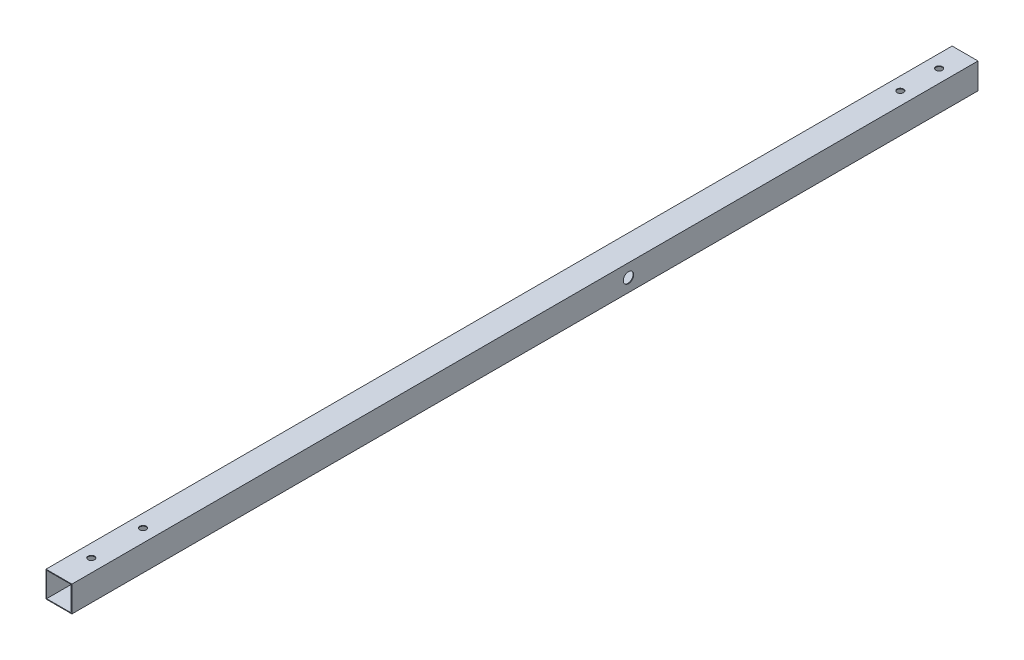
ISO-10303-21;
HEADER;
FILE_DESCRIPTION(('STEP AP214'),'2;1');
FILE_NAME('part.step','',(''),(''),'','','');
FILE_SCHEMA(('AUTOMOTIVE_DESIGN { 1 0 10303 214 1 1 1 1 }'));
ENDSEC;
DATA;
#1=APPLICATION_CONTEXT('core data for automotive mechanical design processes');
#2=APPLICATION_PROTOCOL_DEFINITION('international standard','automotive_design',2000,#1);
#3=PRODUCT_CONTEXT('',#1,'mechanical');
#4=PRODUCT('Part','Part','',(#3));
#5=PRODUCT_RELATED_PRODUCT_CATEGORY('part','',(#4));
#6=PRODUCT_DEFINITION_FORMATION('','',#4);
#7=PRODUCT_DEFINITION_CONTEXT('part definition',#1,'design');
#8=PRODUCT_DEFINITION('design','',#6,#7);
#9=PRODUCT_DEFINITION_SHAPE('','',#8);
#10=(LENGTH_UNIT() NAMED_UNIT(*) SI_UNIT(.MILLI.,.METRE.));
#11=(NAMED_UNIT(*) PLANE_ANGLE_UNIT() SI_UNIT($,.RADIAN.));
#12=(NAMED_UNIT(*) SI_UNIT($,.STERADIAN.) SOLID_ANGLE_UNIT());
#13=UNCERTAINTY_MEASURE_WITH_UNIT(LENGTH_MEASURE(1.E-05),#10,'distance_accuracy_value','');
#14=(GEOMETRIC_REPRESENTATION_CONTEXT(3) GLOBAL_UNCERTAINTY_ASSIGNED_CONTEXT((#13)) GLOBAL_UNIT_ASSIGNED_CONTEXT((#10,
#11,#12)) REPRESENTATION_CONTEXT('',''));
#15=CARTESIAN_POINT('',(0.,0.,0.));
#16=DIRECTION('',(0.,0.,1.));
#17=DIRECTION('',(1.,0.,0.));
#18=AXIS2_PLACEMENT_3D('',#15,#16,#17);
#19=CARTESIAN_POINT('',(10.,10.,700.));
#20=DIRECTION('',(-1.,0.,0.));
#21=DIRECTION('',(0.,-1.,0.));
#22=AXIS2_PLACEMENT_3D('',#19,#20,#21);
#23=PLANE('',#22);
#24=CARTESIAN_POINT('',(10.,0.,270.));
#25=DIRECTION('',(1.,0.,0.));
#26=DIRECTION('',(0.,1.,0.));
#27=AXIS2_PLACEMENT_3D('',#24,#25,#26);
#28=CIRCLE('',#27,3.99999999999999);
#29=CARTESIAN_POINT('',(10.,3.99999999999996,270.));
#30=VERTEX_POINT('',#29);
#31=EDGE_CURVE('E202',#30,#30,#28,.T.);
#32=ORIENTED_EDGE('',*,*,#31,.F.);
#33=EDGE_LOOP('',(#32));
#34=FACE_BOUND('',#33,.T.);
#35=DIRECTION('',(0.,1.,0.));
#36=VECTOR('',#35,1.);
#37=CARTESIAN_POINT('',(10.,10.,0.));
#38=LINE('',#37,#36);
#39=CARTESIAN_POINT('',(10.,-10.,0.));
#40=VERTEX_POINT('',#39);
#41=CARTESIAN_POINT('',(10.,10.,0.));
#42=VERTEX_POINT('',#41);
#43=EDGE_CURVE('E136',#40,#42,#38,.T.);
#44=ORIENTED_EDGE('',*,*,#43,.T.);
#45=DIRECTION('',(0.,0.,-1.));
#46=VECTOR('',#45,1.);
#47=CARTESIAN_POINT('',(10.,10.,700.));
#48=LINE('',#47,#46);
#49=CARTESIAN_POINT('',(10.,10.,700.));
#50=VERTEX_POINT('',#49);
#51=EDGE_CURVE('E11',#50,#42,#48,.T.);
#52=ORIENTED_EDGE('',*,*,#51,.F.);
#53=DIRECTION('',(0.,1.,0.));
#54=VECTOR('',#53,1.);
#55=CARTESIAN_POINT('',(10.,10.,700.));
#56=LINE('',#55,#54);
#57=CARTESIAN_POINT('',(10.,-10.,700.));
#58=VERTEX_POINT('',#57);
#59=EDGE_CURVE('E140',#58,#50,#56,.T.);
#60=ORIENTED_EDGE('',*,*,#59,.F.);
#61=DIRECTION('',(0.,0.,-1.));
#62=VECTOR('',#61,1.);
#63=CARTESIAN_POINT('',(10.,-10.,700.));
#64=LINE('',#63,#62);
#65=EDGE_CURVE('E150',#58,#40,#64,.T.);
#66=ORIENTED_EDGE('',*,*,#65,.T.);
#67=EDGE_LOOP('',(#44,#52,#60,#66));
#68=FACE_BOUND('',#67,.T.);
#69=ADVANCED_FACE('F34',(#34,#68),#23,.F.);
#70=CARTESIAN_POINT('',(-10.,10.,700.));
#71=DIRECTION('',(0.,-1.,0.));
#72=DIRECTION('',(0.,0.,-1.));
#73=AXIS2_PLACEMENT_3D('',#70,#71,#72);
#74=PLANE('',#73);
#75=CARTESIAN_POINT('',(0.,10.,20.));
#76=DIRECTION('',(0.,-1.,0.));
#77=DIRECTION('',(0.,0.,-1.));
#78=AXIS2_PLACEMENT_3D('',#75,#76,#77);
#79=CIRCLE('',#78,2.5);
#80=CARTESIAN_POINT('',(0.,10.,17.5));
#81=VERTEX_POINT('',#80);
#82=EDGE_CURVE('E180',#81,#81,#79,.T.);
#83=ORIENTED_EDGE('',*,*,#82,.T.);
#84=EDGE_LOOP('',(#83));
#85=FACE_BOUND('',#84,.T.);
#86=CARTESIAN_POINT('',(0.,10.,50.));
#87=DIRECTION('',(0.,-1.,0.));
#88=DIRECTION('',(0.,0.,-1.));
#89=AXIS2_PLACEMENT_3D('',#86,#87,#88);
#90=CIRCLE('',#89,2.5);
#91=CARTESIAN_POINT('',(0.,10.,47.5));
#92=VERTEX_POINT('',#91);
#93=EDGE_CURVE('E191',#92,#92,#90,.T.);
#94=ORIENTED_EDGE('',*,*,#93,.T.);
#95=EDGE_LOOP('',(#94));
#96=FACE_BOUND('',#95,.T.);
#97=CARTESIAN_POINT('',(0.,10.,635.));
#98=DIRECTION('',(0.,-1.,0.));
#99=DIRECTION('',(0.,0.,-1.));
#100=AXIS2_PLACEMENT_3D('',#97,#98,#99);
#101=CIRCLE('',#100,2.5);
#102=CARTESIAN_POINT('',(0.,10.,632.5));
#103=VERTEX_POINT('',#102);
#104=EDGE_CURVE('E169',#103,#103,#101,.T.);
#105=ORIENTED_EDGE('',*,*,#104,.T.);
#106=EDGE_LOOP('',(#105));
#107=FACE_BOUND('',#106,.T.);
#108=CARTESIAN_POINT('',(0.,10.,675.));
#109=DIRECTION('',(0.,-1.,0.));
#110=DIRECTION('',(0.,0.,-1.));
#111=AXIS2_PLACEMENT_3D('',#108,#109,#110);
#112=CIRCLE('',#111,2.5);
#113=CARTESIAN_POINT('',(0.,10.,672.5));
#114=VERTEX_POINT('',#113);
#115=EDGE_CURVE('E215',#114,#114,#112,.T.);
#116=ORIENTED_EDGE('',*,*,#115,.T.);
#117=EDGE_LOOP('',(#116));
#118=FACE_BOUND('',#117,.T.);
#119=DIRECTION('',(-1.,0.,0.));
#120=VECTOR('',#119,1.);
#121=CARTESIAN_POINT('',(-10.,10.,0.));
#122=LINE('',#121,#120);
#123=CARTESIAN_POINT('',(-10.,10.,0.));
#124=VERTEX_POINT('',#123);
#125=EDGE_CURVE('E153',#42,#124,#122,.T.);
#126=ORIENTED_EDGE('',*,*,#125,.T.);
#127=DIRECTION('',(0.,0.,-1.));
#128=VECTOR('',#127,1.);
#129=CARTESIAN_POINT('',(-10.,10.,700.));
#130=LINE('',#129,#128);
#131=CARTESIAN_POINT('',(-10.,10.,700.));
#132=VERTEX_POINT('',#131);
#133=EDGE_CURVE('E42',#132,#124,#130,.T.);
#134=ORIENTED_EDGE('',*,*,#133,.F.);
#135=DIRECTION('',(-1.,0.,0.));
#136=VECTOR('',#135,1.);
#137=CARTESIAN_POINT('',(-10.,10.,700.));
#138=LINE('',#137,#136);
#139=EDGE_CURVE('E143',#50,#132,#138,.T.);
#140=ORIENTED_EDGE('',*,*,#139,.F.);
#141=ORIENTED_EDGE('',*,*,#51,.T.);
#142=EDGE_LOOP('',(#126,#134,#140,#141));
#143=FACE_BOUND('',#142,.T.);
#144=ADVANCED_FACE('F244',(#85,#96,#107,#118,#143),#74,.F.);
#145=CARTESIAN_POINT('',(-10.,10.,700.));
#146=DIRECTION('',(1.,0.,0.));
#147=DIRECTION('',(0.,0.,-1.));
#148=AXIS2_PLACEMENT_3D('',#145,#146,#147);
#149=PLANE('',#148);
#150=CARTESIAN_POINT('',(-10.,0.,270.));
#151=DIRECTION('',(1.,0.,0.));
#152=DIRECTION('',(0.,1.,0.));
#153=AXIS2_PLACEMENT_3D('',#150,#151,#152);
#154=CIRCLE('',#153,3.99999999999999);
#155=CARTESIAN_POINT('',(-10.,3.99999999999996,270.));
#156=VERTEX_POINT('',#155);
#157=EDGE_CURVE('E176',#156,#156,#154,.T.);
#158=ORIENTED_EDGE('',*,*,#157,.T.);
#159=EDGE_LOOP('',(#158));
#160=FACE_BOUND('',#159,.T.);
#161=DIRECTION('',(0.,-1.,0.));
#162=VECTOR('',#161,1.);
#163=CARTESIAN_POINT('',(-10.,10.,0.));
#164=LINE('',#163,#162);
#165=CARTESIAN_POINT('',(-10.,-10.,0.));
#166=VERTEX_POINT('',#165);
#167=EDGE_CURVE('E155',#124,#166,#164,.T.);
#168=ORIENTED_EDGE('',*,*,#167,.T.);
#169=DIRECTION('',(0.,0.,-1.));
#170=VECTOR('',#169,1.);
#171=CARTESIAN_POINT('',(-10.,-10.,700.));
#172=LINE('',#171,#170);
#173=CARTESIAN_POINT('',(-10.,-10.,700.));
#174=VERTEX_POINT('',#173);
#175=EDGE_CURVE('E160',#174,#166,#172,.T.);
#176=ORIENTED_EDGE('',*,*,#175,.F.);
#177=DIRECTION('',(0.,-1.,0.));
#178=VECTOR('',#177,1.);
#179=CARTESIAN_POINT('',(-10.,10.,700.));
#180=LINE('',#179,#178);
#181=EDGE_CURVE('E146',#132,#174,#180,.T.);
#182=ORIENTED_EDGE('',*,*,#181,.F.);
#183=ORIENTED_EDGE('',*,*,#133,.T.);
#184=EDGE_LOOP('',(#168,#176,#182,#183));
#185=FACE_BOUND('',#184,.T.);
#186=ADVANCED_FACE('F251',(#160,#185),#149,.F.);
#187=CARTESIAN_POINT('',(-10.,-10.,700.));
#188=DIRECTION('',(0.,1.,0.));
#189=DIRECTION('',(0.,0.,1.));
#190=AXIS2_PLACEMENT_3D('',#187,#188,#189);
#191=PLANE('',#190);
#192=CARTESIAN_POINT('',(0.,-10.,20.));
#193=DIRECTION('',(0.,-1.,0.));
#194=DIRECTION('',(0.,0.,-1.));
#195=AXIS2_PLACEMENT_3D('',#192,#193,#194);
#196=CIRCLE('',#195,2.5);
#197=CARTESIAN_POINT('',(0.,-10.,17.5));
#198=VERTEX_POINT('',#197);
#199=EDGE_CURVE('E186',#198,#198,#196,.T.);
#200=ORIENTED_EDGE('',*,*,#199,.F.);
#201=EDGE_LOOP('',(#200));
#202=FACE_BOUND('',#201,.T.);
#203=CARTESIAN_POINT('',(0.,-10.,50.));
#204=DIRECTION('',(0.,-1.,0.));
#205=DIRECTION('',(0.,0.,-1.));
#206=AXIS2_PLACEMENT_3D('',#203,#204,#205);
#207=CIRCLE('',#206,2.5);
#208=CARTESIAN_POINT('',(0.,-10.,47.5));
#209=VERTEX_POINT('',#208);
#210=EDGE_CURVE('E196',#209,#209,#207,.T.);
#211=ORIENTED_EDGE('',*,*,#210,.F.);
#212=EDGE_LOOP('',(#211));
#213=FACE_BOUND('',#212,.T.);
#214=CARTESIAN_POINT('',(0.,-10.,635.));
#215=DIRECTION('',(0.,-1.,0.));
#216=DIRECTION('',(0.,0.,-1.));
#217=AXIS2_PLACEMENT_3D('',#214,#215,#216);
#218=CIRCLE('',#217,2.5);
#219=CARTESIAN_POINT('',(0.,-10.,632.5));
#220=VERTEX_POINT('',#219);
#221=EDGE_CURVE('E212',#220,#220,#218,.T.);
#222=ORIENTED_EDGE('',*,*,#221,.F.);
#223=EDGE_LOOP('',(#222));
#224=FACE_BOUND('',#223,.T.);
#225=CARTESIAN_POINT('',(0.,-10.,675.));
#226=DIRECTION('',(0.,-1.,0.));
#227=DIRECTION('',(0.,0.,-1.));
#228=AXIS2_PLACEMENT_3D('',#225,#226,#227);
#229=CIRCLE('',#228,2.5);
#230=CARTESIAN_POINT('',(0.,-10.,672.5));
#231=VERTEX_POINT('',#230);
#232=EDGE_CURVE('E209',#231,#231,#229,.T.);
#233=ORIENTED_EDGE('',*,*,#232,.F.);
#234=EDGE_LOOP('',(#233));
#235=FACE_BOUND('',#234,.T.);
#236=DIRECTION('',(1.,0.,0.));
#237=VECTOR('',#236,1.);
#238=CARTESIAN_POINT('',(-10.,-10.,0.));
#239=LINE('',#238,#237);
#240=EDGE_CURVE('E144',#166,#40,#239,.T.);
#241=ORIENTED_EDGE('',*,*,#240,.T.);
#242=ORIENTED_EDGE('',*,*,#65,.F.);
#243=DIRECTION('',(1.,0.,0.));
#244=VECTOR('',#243,1.);
#245=CARTESIAN_POINT('',(-10.,-10.,700.));
#246=LINE('',#245,#244);
#247=EDGE_CURVE('E148',#174,#58,#246,.T.);
#248=ORIENTED_EDGE('',*,*,#247,.F.);
#249=ORIENTED_EDGE('',*,*,#175,.T.);
#250=EDGE_LOOP('',(#241,#242,#248,#249));
#251=FACE_BOUND('',#250,.T.);
#252=ADVANCED_FACE('F268',(#202,#213,#224,#235,#251),#191,.F.);
#253=CARTESIAN_POINT('',(0.,0.,700.));
#254=DIRECTION('',(0.,0.,1.));
#255=DIRECTION('',(1.,0.,0.));
#256=AXIS2_PLACEMENT_3D('',#253,#254,#255);
#257=PLANE('',#256);
#258=DIRECTION('',(0.,1.,0.));
#259=VECTOR('',#258,1.);
#260=CARTESIAN_POINT('',(-9.5,9.5,700.));
#261=LINE('',#260,#259);
#262=CARTESIAN_POINT('',(-9.5,-9.5,700.));
#263=VERTEX_POINT('',#262);
#264=CARTESIAN_POINT('',(-9.5,9.5,700.));
#265=VERTEX_POINT('',#264);
#266=EDGE_CURVE('E102',#263,#265,#261,.T.);
#267=ORIENTED_EDGE('',*,*,#266,.T.);
#268=DIRECTION('',(1.,0.,0.));
#269=VECTOR('',#268,1.);
#270=CARTESIAN_POINT('',(9.5,9.5,700.));
#271=LINE('',#270,#269);
#272=CARTESIAN_POINT('',(9.5,9.5,700.));
#273=VERTEX_POINT('',#272);
#274=EDGE_CURVE('E111',#265,#273,#271,.T.);
#275=ORIENTED_EDGE('',*,*,#274,.T.);
#276=DIRECTION('',(0.,-1.,0.));
#277=VECTOR('',#276,1.);
#278=CARTESIAN_POINT('',(9.5,9.5,700.));
#279=LINE('',#278,#277);
#280=CARTESIAN_POINT('',(9.5,-9.5,700.));
#281=VERTEX_POINT('',#280);
#282=EDGE_CURVE('E50',#273,#281,#279,.T.);
#283=ORIENTED_EDGE('',*,*,#282,.T.);
#284=DIRECTION('',(-1.,0.,0.));
#285=VECTOR('',#284,1.);
#286=CARTESIAN_POINT('',(9.5,-9.5,700.));
#287=LINE('',#286,#285);
#288=EDGE_CURVE('E108',#281,#263,#287,.T.);
#289=ORIENTED_EDGE('',*,*,#288,.T.);
#290=EDGE_LOOP('',(#267,#275,#283,#289));
#291=FACE_BOUND('',#290,.T.);
#292=ORIENTED_EDGE('',*,*,#59,.T.);
#293=ORIENTED_EDGE('',*,*,#139,.T.);
#294=ORIENTED_EDGE('',*,*,#181,.T.);
#295=ORIENTED_EDGE('',*,*,#247,.T.);
#296=EDGE_LOOP('',(#292,#293,#294,#295));
#297=FACE_BOUND('',#296,.T.);
#298=ADVANCED_FACE('F115',(#291,#297),#257,.T.);
#299=CARTESIAN_POINT('',(0.,0.,0.));
#300=DIRECTION('',(0.,0.,1.));
#301=DIRECTION('',(1.,0.,0.));
#302=AXIS2_PLACEMENT_3D('',#299,#300,#301);
#303=PLANE('',#302);
#304=DIRECTION('',(1.,0.,0.));
#305=VECTOR('',#304,1.);
#306=CARTESIAN_POINT('',(9.5,9.5,0.));
#307=LINE('',#306,#305);
#308=CARTESIAN_POINT('',(-9.5,9.5,0.));
#309=VERTEX_POINT('',#308);
#310=CARTESIAN_POINT('',(9.5,9.5,0.));
#311=VERTEX_POINT('',#310);
#312=EDGE_CURVE('E130',#309,#311,#307,.T.);
#313=ORIENTED_EDGE('',*,*,#312,.F.);
#314=DIRECTION('',(0.,1.,0.));
#315=VECTOR('',#314,1.);
#316=CARTESIAN_POINT('',(-9.5,9.5,0.));
#317=LINE('',#316,#315);
#318=CARTESIAN_POINT('',(-9.5,-9.5,0.));
#319=VERTEX_POINT('',#318);
#320=EDGE_CURVE('E58',#319,#309,#317,.T.);
#321=ORIENTED_EDGE('',*,*,#320,.F.);
#322=DIRECTION('',(-1.,0.,0.));
#323=VECTOR('',#322,1.);
#324=CARTESIAN_POINT('',(9.5,-9.5,0.));
#325=LINE('',#324,#323);
#326=CARTESIAN_POINT('',(9.5,-9.5,0.));
#327=VERTEX_POINT('',#326);
#328=EDGE_CURVE('E118',#327,#319,#325,.T.);
#329=ORIENTED_EDGE('',*,*,#328,.F.);
#330=DIRECTION('',(0.,-1.,0.));
#331=VECTOR('',#330,1.);
#332=CARTESIAN_POINT('',(9.5,9.5,0.));
#333=LINE('',#332,#331);
#334=EDGE_CURVE('E121',#311,#327,#333,.T.);
#335=ORIENTED_EDGE('',*,*,#334,.F.);
#336=EDGE_LOOP('',(#313,#321,#329,#335));
#337=FACE_BOUND('',#336,.T.);
#338=ORIENTED_EDGE('',*,*,#43,.F.);
#339=ORIENTED_EDGE('',*,*,#240,.F.);
#340=ORIENTED_EDGE('',*,*,#167,.F.);
#341=ORIENTED_EDGE('',*,*,#125,.F.);
#342=EDGE_LOOP('',(#338,#339,#340,#341));
#343=FACE_BOUND('',#342,.T.);
#344=ADVANCED_FACE('F260',(#337,#343),#303,.F.);
#345=CARTESIAN_POINT('',(-9.5,9.5,700.));
#346=DIRECTION('',(-1.,0.,0.));
#347=DIRECTION('',(0.,-1.,0.));
#348=AXIS2_PLACEMENT_3D('',#345,#346,#347);
#349=PLANE('',#348);
#350=CARTESIAN_POINT('',(-9.5,0.,270.));
#351=DIRECTION('',(-1.,0.,0.));
#352=DIRECTION('',(0.,-1.,0.));
#353=AXIS2_PLACEMENT_3D('',#350,#351,#352);
#354=CIRCLE('',#353,3.99999999999999);
#355=CARTESIAN_POINT('',(-9.5,-4.00000000000003,270.));
#356=VERTEX_POINT('',#355);
#357=EDGE_CURVE('E175',#356,#356,#354,.T.);
#358=ORIENTED_EDGE('',*,*,#357,.T.);
#359=EDGE_LOOP('',(#358));
#360=FACE_BOUND('',#359,.T.);
#361=ORIENTED_EDGE('',*,*,#320,.T.);
#362=DIRECTION('',(0.,0.,-1.));
#363=VECTOR('',#362,1.);
#364=CARTESIAN_POINT('',(-9.5,9.5,700.));
#365=LINE('',#364,#363);
#366=EDGE_CURVE('E98',#265,#309,#365,.T.);
#367=ORIENTED_EDGE('',*,*,#366,.F.);
#368=ORIENTED_EDGE('',*,*,#266,.F.);
#369=DIRECTION('',(0.,0.,-1.));
#370=VECTOR('',#369,1.);
#371=CARTESIAN_POINT('',(-9.5,-9.5,700.));
#372=LINE('',#371,#370);
#373=EDGE_CURVE('E134',#263,#319,#372,.T.);
#374=ORIENTED_EDGE('',*,*,#373,.T.);
#375=EDGE_LOOP('',(#361,#367,#368,#374));
#376=FACE_BOUND('',#375,.T.);
#377=ADVANCED_FACE('F100',(#360,#376),#349,.F.);
#378=CARTESIAN_POINT('',(9.5,-9.5,700.));
#379=DIRECTION('',(0.,-1.,0.));
#380=DIRECTION('',(0.,0.,-1.));
#381=AXIS2_PLACEMENT_3D('',#378,#379,#380);
#382=PLANE('',#381);
#383=CARTESIAN_POINT('',(0.,-9.5,20.));
#384=DIRECTION('',(0.,-1.,0.));
#385=DIRECTION('',(0.,0.,-1.));
#386=AXIS2_PLACEMENT_3D('',#383,#384,#385);
#387=CIRCLE('',#386,2.5);
#388=CARTESIAN_POINT('',(0.,-9.5,17.5));
#389=VERTEX_POINT('',#388);
#390=EDGE_CURVE('E199',#389,#389,#387,.T.);
#391=ORIENTED_EDGE('',*,*,#390,.T.);
#392=EDGE_LOOP('',(#391));
#393=FACE_BOUND('',#392,.T.);
#394=CARTESIAN_POINT('',(0.,-9.5,50.));
#395=DIRECTION('',(0.,-1.,0.));
#396=DIRECTION('',(0.,0.,-1.));
#397=AXIS2_PLACEMENT_3D('',#394,#395,#396);
#398=CIRCLE('',#397,2.5);
#399=CARTESIAN_POINT('',(0.,-9.5,47.5));
#400=VERTEX_POINT('',#399);
#401=EDGE_CURVE('E179',#400,#400,#398,.T.);
#402=ORIENTED_EDGE('',*,*,#401,.T.);
#403=EDGE_LOOP('',(#402));
#404=FACE_BOUND('',#403,.T.);
#405=CARTESIAN_POINT('',(0.,-9.5,635.));
#406=DIRECTION('',(0.,-1.,0.));
#407=DIRECTION('',(0.,0.,-1.));
#408=AXIS2_PLACEMENT_3D('',#405,#406,#407);
#409=CIRCLE('',#408,2.5);
#410=CARTESIAN_POINT('',(0.,-9.5,632.5));
#411=VERTEX_POINT('',#410);
#412=EDGE_CURVE('E124',#411,#411,#409,.T.);
#413=ORIENTED_EDGE('',*,*,#412,.T.);
#414=EDGE_LOOP('',(#413));
#415=FACE_BOUND('',#414,.T.);
#416=CARTESIAN_POINT('',(0.,-9.5,675.));
#417=DIRECTION('',(0.,-1.,0.));
#418=DIRECTION('',(0.,0.,-1.));
#419=AXIS2_PLACEMENT_3D('',#416,#417,#418);
#420=CIRCLE('',#419,2.5);
#421=CARTESIAN_POINT('',(0.,-9.5,672.5));
#422=VERTEX_POINT('',#421);
#423=EDGE_CURVE('E168',#422,#422,#420,.T.);
#424=ORIENTED_EDGE('',*,*,#423,.T.);
#425=EDGE_LOOP('',(#424));
#426=FACE_BOUND('',#425,.T.);
#427=ORIENTED_EDGE('',*,*,#328,.T.);
#428=ORIENTED_EDGE('',*,*,#373,.F.);
#429=ORIENTED_EDGE('',*,*,#288,.F.);
#430=DIRECTION('',(0.,0.,-1.));
#431=VECTOR('',#430,1.);
#432=CARTESIAN_POINT('',(9.5,-9.5,700.));
#433=LINE('',#432,#431);
#434=EDGE_CURVE('E137',#281,#327,#433,.T.);
#435=ORIENTED_EDGE('',*,*,#434,.T.);
#436=EDGE_LOOP('',(#427,#428,#429,#435));
#437=FACE_BOUND('',#436,.T.);
#438=ADVANCED_FACE('F222',(#393,#404,#415,#426,#437),#382,.F.);
#439=CARTESIAN_POINT('',(9.5,9.5,700.));
#440=DIRECTION('',(1.,0.,0.));
#441=DIRECTION('',(0.,1.,0.));
#442=AXIS2_PLACEMENT_3D('',#439,#440,#441);
#443=PLANE('',#442);
#444=CARTESIAN_POINT('',(9.5,0.,270.));
#445=DIRECTION('',(1.,0.,0.));
#446=DIRECTION('',(0.,1.,0.));
#447=AXIS2_PLACEMENT_3D('',#444,#445,#446);
#448=CIRCLE('',#447,3.99999999999999);
#449=CARTESIAN_POINT('',(9.5,3.99999999999996,270.));
#450=VERTEX_POINT('',#449);
#451=EDGE_CURVE('E173',#450,#450,#448,.T.);
#452=ORIENTED_EDGE('',*,*,#451,.T.);
#453=EDGE_LOOP('',(#452));
#454=FACE_BOUND('',#453,.T.);
#455=ORIENTED_EDGE('',*,*,#334,.T.);
#456=ORIENTED_EDGE('',*,*,#434,.F.);
#457=ORIENTED_EDGE('',*,*,#282,.F.);
#458=DIRECTION('',(0.,0.,-1.));
#459=VECTOR('',#458,1.);
#460=CARTESIAN_POINT('',(9.5,9.5,700.));
#461=LINE('',#460,#459);
#462=EDGE_CURVE('E107',#273,#311,#461,.T.);
#463=ORIENTED_EDGE('',*,*,#462,.T.);
#464=EDGE_LOOP('',(#455,#456,#457,#463));
#465=FACE_BOUND('',#464,.T.);
#466=ADVANCED_FACE('F288',(#454,#465),#443,.F.);
#467=CARTESIAN_POINT('',(9.5,9.5,700.));
#468=DIRECTION('',(0.,1.,0.));
#469=DIRECTION('',(0.,0.,1.));
#470=AXIS2_PLACEMENT_3D('',#467,#468,#469);
#471=PLANE('',#470);
#472=CARTESIAN_POINT('',(0.,9.5,20.));
#473=DIRECTION('',(0.,1.,0.));
#474=DIRECTION('',(0.,0.,1.));
#475=AXIS2_PLACEMENT_3D('',#472,#473,#474);
#476=CIRCLE('',#475,2.5);
#477=CARTESIAN_POINT('',(0.,9.5,22.5));
#478=VERTEX_POINT('',#477);
#479=EDGE_CURVE('E37',#478,#478,#476,.T.);
#480=ORIENTED_EDGE('',*,*,#479,.T.);
#481=EDGE_LOOP('',(#480));
#482=FACE_BOUND('',#481,.T.);
#483=CARTESIAN_POINT('',(0.,9.5,50.));
#484=DIRECTION('',(0.,1.,0.));
#485=DIRECTION('',(0.,0.,1.));
#486=AXIS2_PLACEMENT_3D('',#483,#484,#485);
#487=CIRCLE('',#486,2.5);
#488=CARTESIAN_POINT('',(0.,9.5,52.5));
#489=VERTEX_POINT('',#488);
#490=EDGE_CURVE('E177',#489,#489,#487,.T.);
#491=ORIENTED_EDGE('',*,*,#490,.T.);
#492=EDGE_LOOP('',(#491));
#493=FACE_BOUND('',#492,.T.);
#494=CARTESIAN_POINT('',(0.,9.5,635.));
#495=DIRECTION('',(0.,1.,0.));
#496=DIRECTION('',(0.,0.,1.));
#497=AXIS2_PLACEMENT_3D('',#494,#495,#496);
#498=CIRCLE('',#497,2.5);
#499=CARTESIAN_POINT('',(0.,9.5,637.5));
#500=VERTEX_POINT('',#499);
#501=EDGE_CURVE('E170',#500,#500,#498,.T.);
#502=ORIENTED_EDGE('',*,*,#501,.T.);
#503=EDGE_LOOP('',(#502));
#504=FACE_BOUND('',#503,.T.);
#505=CARTESIAN_POINT('',(0.,9.5,675.));
#506=DIRECTION('',(0.,1.,0.));
#507=DIRECTION('',(0.,0.,1.));
#508=AXIS2_PLACEMENT_3D('',#505,#506,#507);
#509=CIRCLE('',#508,2.5);
#510=CARTESIAN_POINT('',(0.,9.5,677.5));
#511=VERTEX_POINT('',#510);
#512=EDGE_CURVE('E165',#511,#511,#509,.T.);
#513=ORIENTED_EDGE('',*,*,#512,.T.);
#514=EDGE_LOOP('',(#513));
#515=FACE_BOUND('',#514,.T.);
#516=ORIENTED_EDGE('',*,*,#312,.T.);
#517=ORIENTED_EDGE('',*,*,#462,.F.);
#518=ORIENTED_EDGE('',*,*,#274,.F.);
#519=ORIENTED_EDGE('',*,*,#366,.T.);
#520=EDGE_LOOP('',(#516,#517,#518,#519));
#521=FACE_BOUND('',#520,.T.);
#522=ADVANCED_FACE('F112',(#482,#493,#504,#515,#521),#471,.F.);
#523=CARTESIAN_POINT('',(0.,10.,675.));
#524=DIRECTION('',(0.,-1.,0.));
#525=DIRECTION('',(0.,0.,-1.));
#526=AXIS2_PLACEMENT_3D('',#523,#524,#525);
#527=CYLINDRICAL_SURFACE('',#526,2.5);
#528=ORIENTED_EDGE('',*,*,#115,.F.);
#529=EDGE_LOOP('',(#528));
#530=FACE_BOUND('',#529,.T.);
#531=ORIENTED_EDGE('',*,*,#512,.F.);
#532=EDGE_LOOP('',(#531));
#533=FACE_BOUND('',#532,.T.);
#534=ADVANCED_FACE('F231',(#530,#533),#527,.F.);
#535=CARTESIAN_POINT('',(0.,10.,635.));
#536=DIRECTION('',(0.,-1.,0.));
#537=DIRECTION('',(0.,0.,-1.));
#538=AXIS2_PLACEMENT_3D('',#535,#536,#537);
#539=CYLINDRICAL_SURFACE('',#538,2.5);
#540=ORIENTED_EDGE('',*,*,#104,.F.);
#541=EDGE_LOOP('',(#540));
#542=FACE_BOUND('',#541,.T.);
#543=ORIENTED_EDGE('',*,*,#501,.F.);
#544=EDGE_LOOP('',(#543));
#545=FACE_BOUND('',#544,.T.);
#546=ADVANCED_FACE('F228',(#542,#545),#539,.F.);
#547=ORIENTED_EDGE('',*,*,#232,.T.);
#548=EDGE_LOOP('',(#547));
#549=FACE_BOUND('',#548,.T.);
#550=ORIENTED_EDGE('',*,*,#423,.F.);
#551=EDGE_LOOP('',(#550));
#552=FACE_BOUND('',#551,.T.);
#553=ADVANCED_FACE('F225',(#549,#552),#527,.F.);
#554=ORIENTED_EDGE('',*,*,#221,.T.);
#555=EDGE_LOOP('',(#554));
#556=FACE_BOUND('',#555,.T.);
#557=ORIENTED_EDGE('',*,*,#412,.F.);
#558=EDGE_LOOP('',(#557));
#559=FACE_BOUND('',#558,.T.);
#560=ADVANCED_FACE('F227',(#556,#559),#539,.F.);
#561=CARTESIAN_POINT('',(-10.,0.,270.));
#562=DIRECTION('',(1.,0.,0.));
#563=DIRECTION('',(0.,1.,0.));
#564=AXIS2_PLACEMENT_3D('',#561,#562,#563);
#565=CYLINDRICAL_SURFACE('',#564,3.99999999999999);
#566=ORIENTED_EDGE('',*,*,#31,.T.);
#567=EDGE_LOOP('',(#566));
#568=FACE_BOUND('',#567,.T.);
#569=ORIENTED_EDGE('',*,*,#451,.F.);
#570=EDGE_LOOP('',(#569));
#571=FACE_BOUND('',#570,.T.);
#572=ADVANCED_FACE('F236',(#568,#571),#565,.F.);
#573=ORIENTED_EDGE('',*,*,#157,.F.);
#574=EDGE_LOOP('',(#573));
#575=FACE_BOUND('',#574,.T.);
#576=ORIENTED_EDGE('',*,*,#357,.F.);
#577=EDGE_LOOP('',(#576));
#578=FACE_BOUND('',#577,.T.);
#579=ADVANCED_FACE('F320',(#575,#578),#565,.F.);
#580=CARTESIAN_POINT('',(0.,10.,50.));
#581=DIRECTION('',(0.,-1.,0.));
#582=DIRECTION('',(0.,0.,-1.));
#583=AXIS2_PLACEMENT_3D('',#580,#581,#582);
#584=CYLINDRICAL_SURFACE('',#583,2.5);
#585=ORIENTED_EDGE('',*,*,#93,.F.);
#586=EDGE_LOOP('',(#585));
#587=FACE_BOUND('',#586,.T.);
#588=ORIENTED_EDGE('',*,*,#490,.F.);
#589=EDGE_LOOP('',(#588));
#590=FACE_BOUND('',#589,.T.);
#591=ADVANCED_FACE('F310',(#587,#590),#584,.F.);
#592=CARTESIAN_POINT('',(0.,10.,20.));
#593=DIRECTION('',(0.,-1.,0.));
#594=DIRECTION('',(0.,0.,-1.));
#595=AXIS2_PLACEMENT_3D('',#592,#593,#594);
#596=CYLINDRICAL_SURFACE('',#595,2.5);
#597=ORIENTED_EDGE('',*,*,#82,.F.);
#598=EDGE_LOOP('',(#597));
#599=FACE_BOUND('',#598,.T.);
#600=ORIENTED_EDGE('',*,*,#479,.F.);
#601=EDGE_LOOP('',(#600));
#602=FACE_BOUND('',#601,.T.);
#603=ADVANCED_FACE('F307',(#599,#602),#596,.F.);
#604=ORIENTED_EDGE('',*,*,#210,.T.);
#605=EDGE_LOOP('',(#604));
#606=FACE_BOUND('',#605,.T.);
#607=ORIENTED_EDGE('',*,*,#401,.F.);
#608=EDGE_LOOP('',(#607));
#609=FACE_BOUND('',#608,.T.);
#610=ADVANCED_FACE('F304',(#606,#609),#584,.F.);
#611=ORIENTED_EDGE('',*,*,#199,.T.);
#612=EDGE_LOOP('',(#611));
#613=FACE_BOUND('',#612,.T.);
#614=ORIENTED_EDGE('',*,*,#390,.F.);
#615=EDGE_LOOP('',(#614));
#616=FACE_BOUND('',#615,.T.);
#617=ADVANCED_FACE('F306',(#613,#616),#596,.F.);
#618=CLOSED_SHELL('',(#69,#144,#186,#252,#298,#344,#377,#438,#466,#522,#534,#546,#553,#560,#572,
#579,#591,#603,#610,#617));
#619=MANIFOLD_SOLID_BREP('B2',#618);
#620=ADVANCED_BREP_SHAPE_REPRESENTATION('',(#18,#619),#14);
#621=SHAPE_DEFINITION_REPRESENTATION(#9,#620);
ENDSEC;
END-ISO-10303-21;
